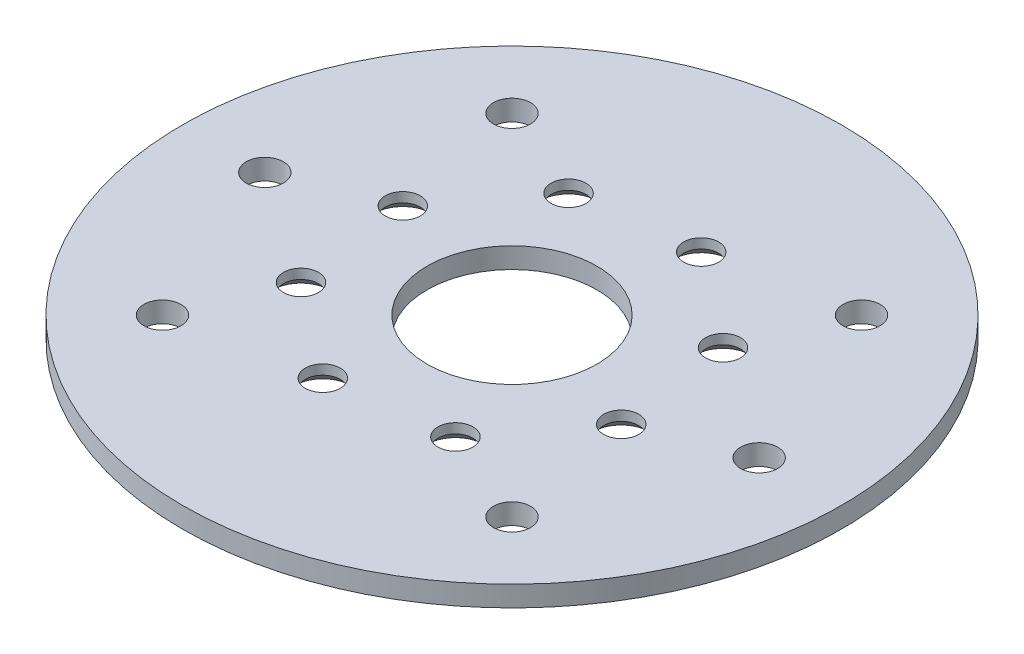
ISO-10303-21;
HEADER;
FILE_DESCRIPTION(('STEP AP214'),'2;1');
FILE_NAME('part.step','',(''),(''),'','','');
FILE_SCHEMA(('AUTOMOTIVE_DESIGN { 1 0 10303 214 1 1 1 1 }'));
ENDSEC;
DATA;
#1=APPLICATION_CONTEXT('core data for automotive mechanical design processes');
#2=APPLICATION_PROTOCOL_DEFINITION('international standard','automotive_design',2000,#1);
#3=PRODUCT_CONTEXT('',#1,'mechanical');
#4=PRODUCT('Part','Part','',(#3));
#5=PRODUCT_RELATED_PRODUCT_CATEGORY('part','',(#4));
#6=PRODUCT_DEFINITION_FORMATION('','',#4);
#7=PRODUCT_DEFINITION_CONTEXT('part definition',#1,'design');
#8=PRODUCT_DEFINITION('design','',#6,#7);
#9=PRODUCT_DEFINITION_SHAPE('','',#8);
#10=(LENGTH_UNIT() NAMED_UNIT(*) SI_UNIT(.MILLI.,.METRE.));
#11=(NAMED_UNIT(*) PLANE_ANGLE_UNIT() SI_UNIT($,.RADIAN.));
#12=(NAMED_UNIT(*) SI_UNIT($,.STERADIAN.) SOLID_ANGLE_UNIT());
#13=UNCERTAINTY_MEASURE_WITH_UNIT(LENGTH_MEASURE(1.E-05),#10,'distance_accuracy_value','');
#14=(GEOMETRIC_REPRESENTATION_CONTEXT(3) GLOBAL_UNCERTAINTY_ASSIGNED_CONTEXT((#13)) GLOBAL_UNIT_ASSIGNED_CONTEXT((#10,
#11,#12)) REPRESENTATION_CONTEXT('',''));
#15=CARTESIAN_POINT('',(0.,0.,0.));
#16=DIRECTION('',(0.,0.,1.));
#17=DIRECTION('',(1.,0.,0.));
#18=AXIS2_PLACEMENT_3D('',#15,#16,#17);
#19=CARTESIAN_POINT('',(0.,0.,0.));
#20=DIRECTION('',(0.,1.,0.));
#21=DIRECTION('',(0.,0.,1.));
#22=AXIS2_PLACEMENT_3D('',#19,#20,#21);
#23=PLANE('',#22);
#24=CARTESIAN_POINT('',(-16.9705627484772,0.,-16.9705627484771));
#25=DIRECTION('',(0.,-1.,0.));
#26=DIRECTION('',(0.,0.,-1.));
#27=AXIS2_PLACEMENT_3D('',#24,#25,#26);
#28=CIRCLE('',#27,1.8);
#29=CARTESIAN_POINT('',(-16.9705627484772,0.,-18.7705627484771));
#30=VERTEX_POINT('',#29);
#31=EDGE_CURVE('E142',#30,#30,#28,.T.);
#32=ORIENTED_EDGE('',*,*,#31,.F.);
#33=EDGE_LOOP('',(#32));
#34=FACE_BOUND('',#33,.T.);
#35=CARTESIAN_POINT('',(-24.,0.,1.64798730217797E-13));
#36=DIRECTION('',(0.,-1.,0.));
#37=DIRECTION('',(0.,0.,-1.));
#38=AXIS2_PLACEMENT_3D('',#35,#36,#37);
#39=CIRCLE('',#38,1.8);
#40=CARTESIAN_POINT('',(-24.,0.,-1.79999999999983));
#41=VERTEX_POINT('',#40);
#42=EDGE_CURVE('E136',#41,#41,#39,.T.);
#43=ORIENTED_EDGE('',*,*,#42,.F.);
#44=EDGE_LOOP('',(#43));
#45=FACE_BOUND('',#44,.T.);
#46=CARTESIAN_POINT('',(16.9705627484774,0.,16.9705627484769));
#47=DIRECTION('',(0.,-1.,0.));
#48=DIRECTION('',(0.,0.,-1.));
#49=AXIS2_PLACEMENT_3D('',#46,#47,#48);
#50=CIRCLE('',#49,1.8);
#51=CARTESIAN_POINT('',(16.9705627484774,0.,15.1705627484769));
#52=VERTEX_POINT('',#51);
#53=EDGE_CURVE('E124',#52,#52,#50,.T.);
#54=ORIENTED_EDGE('',*,*,#53,.F.);
#55=EDGE_LOOP('',(#54));
#56=FACE_BOUND('',#55,.T.);
#57=CARTESIAN_POINT('',(-12.9903810567648,0.,7.5000000000011));
#58=DIRECTION('',(0.,-1.,0.));
#59=DIRECTION('',(0.,0.,-1.));
#60=AXIS2_PLACEMENT_3D('',#57,#58,#59);
#61=CIRCLE('',#60,2.75);
#62=CARTESIAN_POINT('',(-12.9903810567648,0.,4.7500000000011));
#63=VERTEX_POINT('',#62);
#64=EDGE_CURVE('E82',#63,#63,#61,.T.);
#65=ORIENTED_EDGE('',*,*,#64,.F.);
#66=EDGE_LOOP('',(#65));
#67=FACE_BOUND('',#66,.T.);
#68=CARTESIAN_POINT('',(-14.4888873943349,0.,-3.88228567653623));
#69=DIRECTION('',(0.,-1.,0.));
#70=DIRECTION('',(0.,0.,-1.));
#71=AXIS2_PLACEMENT_3D('',#68,#69,#70);
#72=CIRCLE('',#71,2.75);
#73=CARTESIAN_POINT('',(-14.4888873943349,0.,-6.63228567653623));
#74=VERTEX_POINT('',#73);
#75=EDGE_CURVE('E73',#74,#74,#72,.T.);
#76=ORIENTED_EDGE('',*,*,#75,.F.);
#77=EDGE_LOOP('',(#76));
#78=FACE_BOUND('',#77,.T.);
#79=CARTESIAN_POINT('',(-7.49999999999965,0.,-12.9903810567651));
#80=DIRECTION('',(0.,-1.,0.));
#81=DIRECTION('',(0.,0.,-1.));
#82=AXIS2_PLACEMENT_3D('',#79,#80,#81);
#83=CIRCLE('',#82,2.75);
#84=CARTESIAN_POINT('',(-7.49999999999965,0.,-15.7403810567651));
#85=VERTEX_POINT('',#84);
#86=EDGE_CURVE('E64',#85,#85,#83,.T.);
#87=ORIENTED_EDGE('',*,*,#86,.F.);
#88=EDGE_LOOP('',(#87));
#89=FACE_BOUND('',#88,.T.);
#90=CARTESIAN_POINT('',(0.,0.,0.));
#91=DIRECTION('',(0.,1.,0.));
#92=DIRECTION('',(0.,0.,1.));
#93=AXIS2_PLACEMENT_3D('',#90,#91,#92);
#94=CIRCLE('',#93,32.);
#95=CARTESIAN_POINT('',(0.,0.,32.));
#96=VERTEX_POINT('',#95);
#97=EDGE_CURVE('E35',#96,#96,#94,.T.);
#98=ORIENTED_EDGE('',*,*,#97,.F.);
#99=EDGE_LOOP('',(#98));
#100=FACE_BOUND('',#99,.T.);
#101=CARTESIAN_POINT('',(0.,0.,0.));
#102=DIRECTION('',(0.,1.,0.));
#103=DIRECTION('',(0.,0.,1.));
#104=AXIS2_PLACEMENT_3D('',#101,#102,#103);
#105=CIRCLE('',#104,8.25);
#106=CARTESIAN_POINT('',(0.,0.,8.25));
#107=VERTEX_POINT('',#106);
#108=EDGE_CURVE('E44',#107,#107,#105,.T.);
#109=ORIENTED_EDGE('',*,*,#108,.T.);
#110=EDGE_LOOP('',(#109));
#111=FACE_BOUND('',#110,.T.);
#112=CARTESIAN_POINT('',(3.88228567653768,0.,-14.4888873943352));
#113=DIRECTION('',(0.,-1.,0.));
#114=DIRECTION('',(0.,0.,-1.));
#115=AXIS2_PLACEMENT_3D('',#112,#113,#114);
#116=CIRCLE('',#115,2.75);
#117=CARTESIAN_POINT('',(3.88228567653768,0.,-17.2388873943352));
#118=VERTEX_POINT('',#117);
#119=EDGE_CURVE('E55',#118,#118,#116,.T.);
#120=ORIENTED_EDGE('',*,*,#119,.F.);
#121=EDGE_LOOP('',(#120));
#122=FACE_BOUND('',#121,.T.);
#123=CARTESIAN_POINT('',(-3.88228567653586,0.,14.4888873943363));
#124=DIRECTION('',(0.,-1.,0.));
#125=DIRECTION('',(0.,0.,-1.));
#126=AXIS2_PLACEMENT_3D('',#123,#124,#125);
#127=CIRCLE('',#126,2.75);
#128=CARTESIAN_POINT('',(-3.88228567653586,0.,11.7388873943363));
#129=VERTEX_POINT('',#128);
#130=EDGE_CURVE('E91',#129,#129,#127,.T.);
#131=ORIENTED_EDGE('',*,*,#130,.F.);
#132=EDGE_LOOP('',(#131));
#133=FACE_BOUND('',#132,.T.);
#134=CARTESIAN_POINT('',(7.50000000000146,0.,12.9903810567662));
#135=DIRECTION('',(0.,-1.,0.));
#136=DIRECTION('',(0.,0.,-1.));
#137=AXIS2_PLACEMENT_3D('',#134,#135,#136);
#138=CIRCLE('',#137,2.75);
#139=CARTESIAN_POINT('',(7.50000000000146,0.,10.2403810567662));
#140=VERTEX_POINT('',#139);
#141=EDGE_CURVE('E100',#140,#140,#138,.T.);
#142=ORIENTED_EDGE('',*,*,#141,.F.);
#143=EDGE_LOOP('',(#142));
#144=FACE_BOUND('',#143,.T.);
#145=CARTESIAN_POINT('',(14.4888873943367,0.,3.88228567653731));
#146=DIRECTION('',(0.,-1.,0.));
#147=DIRECTION('',(0.,0.,-1.));
#148=AXIS2_PLACEMENT_3D('',#145,#146,#147);
#149=CIRCLE('',#148,2.75);
#150=CARTESIAN_POINT('',(14.4888873943367,0.,1.13228567653731));
#151=VERTEX_POINT('',#150);
#152=EDGE_CURVE('E109',#151,#151,#149,.T.);
#153=ORIENTED_EDGE('',*,*,#152,.F.);
#154=EDGE_LOOP('',(#153));
#155=FACE_BOUND('',#154,.T.);
#156=CARTESIAN_POINT('',(12.9903810567666,0.,-7.50000000000002));
#157=DIRECTION('',(0.,-1.,0.));
#158=DIRECTION('',(0.,0.,-1.));
#159=AXIS2_PLACEMENT_3D('',#156,#157,#158);
#160=CIRCLE('',#159,2.75);
#161=CARTESIAN_POINT('',(12.9903810567666,0.,-10.25));
#162=VERTEX_POINT('',#161);
#163=EDGE_CURVE('E118',#162,#162,#160,.T.);
#164=ORIENTED_EDGE('',*,*,#163,.F.);
#165=EDGE_LOOP('',(#164));
#166=FACE_BOUND('',#165,.T.);
#167=CARTESIAN_POINT('',(-16.970562748477,0.,16.9705627484773));
#168=DIRECTION('',(0.,-1.,0.));
#169=DIRECTION('',(0.,0.,-1.));
#170=AXIS2_PLACEMENT_3D('',#167,#168,#169);
#171=CIRCLE('',#170,1.8);
#172=CARTESIAN_POINT('',(-16.970562748477,0.,15.1705627484773));
#173=VERTEX_POINT('',#172);
#174=EDGE_CURVE('E130',#173,#173,#171,.T.);
#175=ORIENTED_EDGE('',*,*,#174,.F.);
#176=EDGE_LOOP('',(#175));
#177=FACE_BOUND('',#176,.T.);
#178=CARTESIAN_POINT('',(16.9705627484769,0.,-16.9705627484774));
#179=DIRECTION('',(0.,-1.,0.));
#180=DIRECTION('',(0.,0.,-1.));
#181=AXIS2_PLACEMENT_3D('',#178,#179,#180);
#182=CIRCLE('',#181,1.8);
#183=CARTESIAN_POINT('',(16.9705627484769,0.,-18.7705627484774));
#184=VERTEX_POINT('',#183);
#185=EDGE_CURVE('E148',#184,#184,#182,.T.);
#186=ORIENTED_EDGE('',*,*,#185,.F.);
#187=EDGE_LOOP('',(#186));
#188=FACE_BOUND('',#187,.T.);
#189=CARTESIAN_POINT('',(24.,0.,0.));
#190=DIRECTION('',(0.,-1.,0.));
#191=DIRECTION('',(0.,0.,-1.));
#192=AXIS2_PLACEMENT_3D('',#189,#190,#191);
#193=CIRCLE('',#192,1.8);
#194=CARTESIAN_POINT('',(24.,0.,-1.8));
#195=VERTEX_POINT('',#194);
#196=EDGE_CURVE('E154',#195,#195,#193,.T.);
#197=ORIENTED_EDGE('',*,*,#196,.F.);
#198=EDGE_LOOP('',(#197));
#199=FACE_BOUND('',#198,.T.);
#200=ADVANCED_FACE('F31',(#34,#45,#56,#67,#78,#89,#100,#111,#122,#133,#144,#155,#166,#177,#188,
#199),#23,.F.);
#201=CARTESIAN_POINT('',(0.,2.,0.));
#202=DIRECTION('',(0.,1.,0.));
#203=DIRECTION('',(0.,0.,1.));
#204=AXIS2_PLACEMENT_3D('',#201,#202,#203);
#205=PLANE('',#204);
#206=CARTESIAN_POINT('',(24.,2.,0.));
#207=DIRECTION('',(0.,1.,0.));
#208=DIRECTION('',(0.,0.,1.));
#209=AXIS2_PLACEMENT_3D('',#206,#207,#208);
#210=CIRCLE('',#209,1.8);
#211=CARTESIAN_POINT('',(24.,2.,1.8));
#212=VERTEX_POINT('',#211);
#213=EDGE_CURVE('E151',#212,#212,#210,.T.);
#214=ORIENTED_EDGE('',*,*,#213,.F.);
#215=EDGE_LOOP('',(#214));
#216=FACE_BOUND('',#215,.T.);
#217=CARTESIAN_POINT('',(16.9705627484769,2.,-16.9705627484774));
#218=DIRECTION('',(0.,1.,0.));
#219=DIRECTION('',(0.,0.,1.));
#220=AXIS2_PLACEMENT_3D('',#217,#218,#219);
#221=CIRCLE('',#220,1.8);
#222=CARTESIAN_POINT('',(16.9705627484769,2.,-15.1705627484774));
#223=VERTEX_POINT('',#222);
#224=EDGE_CURVE('E145',#223,#223,#221,.T.);
#225=ORIENTED_EDGE('',*,*,#224,.F.);
#226=EDGE_LOOP('',(#225));
#227=FACE_BOUND('',#226,.T.);
#228=CARTESIAN_POINT('',(-16.9705627484772,2.,-16.9705627484771));
#229=DIRECTION('',(0.,1.,0.));
#230=DIRECTION('',(0.,0.,1.));
#231=AXIS2_PLACEMENT_3D('',#228,#229,#230);
#232=CIRCLE('',#231,1.8);
#233=CARTESIAN_POINT('',(-16.9705627484772,2.,-15.1705627484771));
#234=VERTEX_POINT('',#233);
#235=EDGE_CURVE('E139',#234,#234,#232,.T.);
#236=ORIENTED_EDGE('',*,*,#235,.F.);
#237=EDGE_LOOP('',(#236));
#238=FACE_BOUND('',#237,.T.);
#239=CARTESIAN_POINT('',(-24.,2.,1.64798730217797E-13));
#240=DIRECTION('',(0.,1.,0.));
#241=DIRECTION('',(0.,0.,1.));
#242=AXIS2_PLACEMENT_3D('',#239,#240,#241);
#243=CIRCLE('',#242,1.8);
#244=CARTESIAN_POINT('',(-24.,2.,1.80000000000016));
#245=VERTEX_POINT('',#244);
#246=EDGE_CURVE('E133',#245,#245,#243,.T.);
#247=ORIENTED_EDGE('',*,*,#246,.F.);
#248=EDGE_LOOP('',(#247));
#249=FACE_BOUND('',#248,.T.);
#250=CARTESIAN_POINT('',(-16.970562748477,2.,16.9705627484773));
#251=DIRECTION('',(0.,1.,0.));
#252=DIRECTION('',(0.,0.,1.));
#253=AXIS2_PLACEMENT_3D('',#250,#251,#252);
#254=CIRCLE('',#253,1.8);
#255=CARTESIAN_POINT('',(-16.970562748477,2.,18.7705627484773));
#256=VERTEX_POINT('',#255);
#257=EDGE_CURVE('E127',#256,#256,#254,.T.);
#258=ORIENTED_EDGE('',*,*,#257,.F.);
#259=EDGE_LOOP('',(#258));
#260=FACE_BOUND('',#259,.T.);
#261=CARTESIAN_POINT('',(16.9705627484774,2.,16.9705627484769));
#262=DIRECTION('',(0.,1.,0.));
#263=DIRECTION('',(0.,0.,1.));
#264=AXIS2_PLACEMENT_3D('',#261,#262,#263);
#265=CIRCLE('',#264,1.8);
#266=CARTESIAN_POINT('',(16.9705627484774,2.,18.7705627484769));
#267=VERTEX_POINT('',#266);
#268=EDGE_CURVE('E121',#267,#267,#265,.T.);
#269=ORIENTED_EDGE('',*,*,#268,.F.);
#270=EDGE_LOOP('',(#269));
#271=FACE_BOUND('',#270,.T.);
#272=CARTESIAN_POINT('',(12.9903810567666,2.,-7.50000000000002));
#273=DIRECTION('',(0.,1.,0.));
#274=DIRECTION('',(0.,0.,1.));
#275=AXIS2_PLACEMENT_3D('',#272,#273,#274);
#276=CIRCLE('',#275,1.7);
#277=CARTESIAN_POINT('',(12.9903810567666,2.,-5.80000000000002));
#278=VERTEX_POINT('',#277);
#279=EDGE_CURVE('E112',#278,#278,#276,.T.);
#280=ORIENTED_EDGE('',*,*,#279,.F.);
#281=EDGE_LOOP('',(#280));
#282=FACE_BOUND('',#281,.T.);
#283=CARTESIAN_POINT('',(14.4888873943367,2.,3.88228567653731));
#284=DIRECTION('',(0.,1.,0.));
#285=DIRECTION('',(0.,0.,1.));
#286=AXIS2_PLACEMENT_3D('',#283,#284,#285);
#287=CIRCLE('',#286,1.7);
#288=CARTESIAN_POINT('',(14.4888873943367,2.,5.58228567653731));
#289=VERTEX_POINT('',#288);
#290=EDGE_CURVE('E103',#289,#289,#287,.T.);
#291=ORIENTED_EDGE('',*,*,#290,.F.);
#292=EDGE_LOOP('',(#291));
#293=FACE_BOUND('',#292,.T.);
#294=CARTESIAN_POINT('',(7.50000000000146,2.,12.9903810567662));
#295=DIRECTION('',(0.,1.,0.));
#296=DIRECTION('',(0.,0.,1.));
#297=AXIS2_PLACEMENT_3D('',#294,#295,#296);
#298=CIRCLE('',#297,1.7);
#299=CARTESIAN_POINT('',(7.50000000000146,2.,14.6903810567662));
#300=VERTEX_POINT('',#299);
#301=EDGE_CURVE('E94',#300,#300,#298,.T.);
#302=ORIENTED_EDGE('',*,*,#301,.F.);
#303=EDGE_LOOP('',(#302));
#304=FACE_BOUND('',#303,.T.);
#305=CARTESIAN_POINT('',(-3.88228567653586,2.,14.4888873943363));
#306=DIRECTION('',(0.,1.,0.));
#307=DIRECTION('',(0.,0.,1.));
#308=AXIS2_PLACEMENT_3D('',#305,#306,#307);
#309=CIRCLE('',#308,1.7);
#310=CARTESIAN_POINT('',(-3.88228567653586,2.,16.1888873943363));
#311=VERTEX_POINT('',#310);
#312=EDGE_CURVE('E85',#311,#311,#309,.T.);
#313=ORIENTED_EDGE('',*,*,#312,.F.);
#314=EDGE_LOOP('',(#313));
#315=FACE_BOUND('',#314,.T.);
#316=CARTESIAN_POINT('',(-12.9903810567648,2.,7.5000000000011));
#317=DIRECTION('',(0.,1.,0.));
#318=DIRECTION('',(0.,0.,1.));
#319=AXIS2_PLACEMENT_3D('',#316,#317,#318);
#320=CIRCLE('',#319,1.7);
#321=CARTESIAN_POINT('',(-12.9903810567648,2.,9.2000000000011));
#322=VERTEX_POINT('',#321);
#323=EDGE_CURVE('E76',#322,#322,#320,.T.);
#324=ORIENTED_EDGE('',*,*,#323,.F.);
#325=EDGE_LOOP('',(#324));
#326=FACE_BOUND('',#325,.T.);
#327=CARTESIAN_POINT('',(-14.4888873943349,2.,-3.88228567653623));
#328=DIRECTION('',(0.,1.,0.));
#329=DIRECTION('',(0.,0.,1.));
#330=AXIS2_PLACEMENT_3D('',#327,#328,#329);
#331=CIRCLE('',#330,1.7);
#332=CARTESIAN_POINT('',(-14.4888873943349,2.,-2.18228567653623));
#333=VERTEX_POINT('',#332);
#334=EDGE_CURVE('E67',#333,#333,#331,.T.);
#335=ORIENTED_EDGE('',*,*,#334,.F.);
#336=EDGE_LOOP('',(#335));
#337=FACE_BOUND('',#336,.T.);
#338=CARTESIAN_POINT('',(-7.49999999999965,2.,-12.9903810567651));
#339=DIRECTION('',(0.,1.,0.));
#340=DIRECTION('',(0.,0.,1.));
#341=AXIS2_PLACEMENT_3D('',#338,#339,#340);
#342=CIRCLE('',#341,1.7);
#343=CARTESIAN_POINT('',(-7.49999999999965,2.,-11.2903810567651));
#344=VERTEX_POINT('',#343);
#345=EDGE_CURVE('E58',#344,#344,#342,.T.);
#346=ORIENTED_EDGE('',*,*,#345,.F.);
#347=EDGE_LOOP('',(#346));
#348=FACE_BOUND('',#347,.T.);
#349=CARTESIAN_POINT('',(3.88228567653768,2.,-14.4888873943352));
#350=DIRECTION('',(0.,1.,0.));
#351=DIRECTION('',(0.,0.,1.));
#352=AXIS2_PLACEMENT_3D('',#349,#350,#351);
#353=CIRCLE('',#352,1.7);
#354=CARTESIAN_POINT('',(3.88228567653768,2.,-12.7888873943352));
#355=VERTEX_POINT('',#354);
#356=EDGE_CURVE('E47',#355,#355,#353,.T.);
#357=ORIENTED_EDGE('',*,*,#356,.F.);
#358=EDGE_LOOP('',(#357));
#359=FACE_BOUND('',#358,.T.);
#360=CARTESIAN_POINT('',(0.,2.,0.));
#361=DIRECTION('',(0.,1.,0.));
#362=DIRECTION('',(0.,0.,1.));
#363=AXIS2_PLACEMENT_3D('',#360,#361,#362);
#364=CIRCLE('',#363,32.);
#365=CARTESIAN_POINT('',(0.,2.,32.));
#366=VERTEX_POINT('',#365);
#367=EDGE_CURVE('E10',#366,#366,#364,.T.);
#368=ORIENTED_EDGE('',*,*,#367,.T.);
#369=EDGE_LOOP('',(#368));
#370=FACE_BOUND('',#369,.T.);
#371=CARTESIAN_POINT('',(0.,2.,0.));
#372=DIRECTION('',(0.,1.,0.));
#373=DIRECTION('',(0.,0.,1.));
#374=AXIS2_PLACEMENT_3D('',#371,#372,#373);
#375=CIRCLE('',#374,8.25);
#376=CARTESIAN_POINT('',(0.,2.,8.25));
#377=VERTEX_POINT('',#376);
#378=EDGE_CURVE('E42',#377,#377,#375,.T.);
#379=ORIENTED_EDGE('',*,*,#378,.F.);
#380=EDGE_LOOP('',(#379));
#381=FACE_BOUND('',#380,.T.);
#382=ADVANCED_FACE('F162',(#216,#227,#238,#249,#260,#271,#282,#293,#304,#315,#326,#337,#348,
#359,#370,#381),#205,.T.);
#383=CARTESIAN_POINT('',(0.,2.,0.));
#384=DIRECTION('',(0.,-1.,0.));
#385=DIRECTION('',(0.,0.,-1.));
#386=AXIS2_PLACEMENT_3D('',#383,#384,#385);
#387=CYLINDRICAL_SURFACE('',#386,32.);
#388=ORIENTED_EDGE('',*,*,#367,.F.);
#389=EDGE_LOOP('',(#388));
#390=FACE_BOUND('',#389,.T.);
#391=ORIENTED_EDGE('',*,*,#97,.T.);
#392=EDGE_LOOP('',(#391));
#393=FACE_BOUND('',#392,.T.);
#394=ADVANCED_FACE('F33',(#390,#393),#387,.T.);
#395=CARTESIAN_POINT('',(0.,2.,0.));
#396=DIRECTION('',(0.,-1.,0.));
#397=DIRECTION('',(0.,0.,-1.));
#398=AXIS2_PLACEMENT_3D('',#395,#396,#397);
#399=CYLINDRICAL_SURFACE('',#398,8.25);
#400=ORIENTED_EDGE('',*,*,#378,.T.);
#401=EDGE_LOOP('',(#400));
#402=FACE_BOUND('',#401,.T.);
#403=ORIENTED_EDGE('',*,*,#108,.F.);
#404=EDGE_LOOP('',(#403));
#405=FACE_BOUND('',#404,.T.);
#406=ADVANCED_FACE('F172',(#402,#405),#399,.F.);
#407=CARTESIAN_POINT('',(3.88228567653768,0.,-14.4888873943352));
#408=DIRECTION('',(0.,-1.,0.));
#409=DIRECTION('',(0.,0.,-1.));
#410=AXIS2_PLACEMENT_3D('',#407,#408,#409);
#411=CYLINDRICAL_SURFACE('',#410,1.7);
#412=CARTESIAN_POINT('',(3.88228567653768,1.05,-14.4888873943352));
#413=DIRECTION('',(0.,-1.,0.));
#414=DIRECTION('',(0.,0.,-1.));
#415=AXIS2_PLACEMENT_3D('',#412,#413,#414);
#416=CIRCLE('',#415,1.7);
#417=CARTESIAN_POINT('',(3.88228567653768,1.05,-16.1888873943352));
#418=VERTEX_POINT('',#417);
#419=EDGE_CURVE('E52',#418,#418,#416,.T.);
#420=ORIENTED_EDGE('',*,*,#419,.T.);
#421=EDGE_LOOP('',(#420));
#422=FACE_BOUND('',#421,.T.);
#423=ORIENTED_EDGE('',*,*,#356,.T.);
#424=EDGE_LOOP('',(#423));
#425=FACE_BOUND('',#424,.T.);
#426=ADVANCED_FACE('F175',(#422,#425),#411,.F.);
#427=CARTESIAN_POINT('',(3.88228567653768,0.,-14.4888873943352));
#428=DIRECTION('',(0.,-1.,0.));
#429=DIRECTION('',(0.,0.,-1.));
#430=AXIS2_PLACEMENT_3D('',#427,#428,#429);
#431=CONICAL_SURFACE('',#430,2.75,0.785398163397448);
#432=ORIENTED_EDGE('',*,*,#419,.F.);
#433=EDGE_LOOP('',(#432));
#434=FACE_BOUND('',#433,.T.);
#435=ORIENTED_EDGE('',*,*,#119,.T.);
#436=EDGE_LOOP('',(#435));
#437=FACE_BOUND('',#436,.T.);
#438=ADVANCED_FACE('F179',(#434,#437),#431,.F.);
#439=CARTESIAN_POINT('',(-7.49999999999965,0.,-12.9903810567651));
#440=DIRECTION('',(0.,-1.,0.));
#441=DIRECTION('',(0.,0.,-1.));
#442=AXIS2_PLACEMENT_3D('',#439,#440,#441);
#443=CYLINDRICAL_SURFACE('',#442,1.7);
#444=CARTESIAN_POINT('',(-7.49999999999965,1.05,-12.9903810567651));
#445=DIRECTION('',(0.,-1.,0.));
#446=DIRECTION('',(0.,0.,-1.));
#447=AXIS2_PLACEMENT_3D('',#444,#445,#446);
#448=CIRCLE('',#447,1.7);
#449=CARTESIAN_POINT('',(-7.49999999999965,1.05,-14.6903810567651));
#450=VERTEX_POINT('',#449);
#451=EDGE_CURVE('E61',#450,#450,#448,.T.);
#452=ORIENTED_EDGE('',*,*,#451,.T.);
#453=EDGE_LOOP('',(#452));
#454=FACE_BOUND('',#453,.T.);
#455=ORIENTED_EDGE('',*,*,#345,.T.);
#456=EDGE_LOOP('',(#455));
#457=FACE_BOUND('',#456,.T.);
#458=ADVANCED_FACE('F183',(#454,#457),#443,.F.);
#459=CARTESIAN_POINT('',(-7.49999999999965,0.,-12.9903810567651));
#460=DIRECTION('',(0.,-1.,0.));
#461=DIRECTION('',(0.,0.,-1.));
#462=AXIS2_PLACEMENT_3D('',#459,#460,#461);
#463=CONICAL_SURFACE('',#462,2.75,0.785398163397448);
#464=ORIENTED_EDGE('',*,*,#451,.F.);
#465=EDGE_LOOP('',(#464));
#466=FACE_BOUND('',#465,.T.);
#467=ORIENTED_EDGE('',*,*,#86,.T.);
#468=EDGE_LOOP('',(#467));
#469=FACE_BOUND('',#468,.T.);
#470=ADVANCED_FACE('F187',(#466,#469),#463,.F.);
#471=CARTESIAN_POINT('',(-14.4888873943349,0.,-3.88228567653623));
#472=DIRECTION('',(0.,-1.,0.));
#473=DIRECTION('',(0.,0.,-1.));
#474=AXIS2_PLACEMENT_3D('',#471,#472,#473);
#475=CYLINDRICAL_SURFACE('',#474,1.7);
#476=CARTESIAN_POINT('',(-14.4888873943349,1.05,-3.88228567653623));
#477=DIRECTION('',(0.,-1.,0.));
#478=DIRECTION('',(0.,0.,-1.));
#479=AXIS2_PLACEMENT_3D('',#476,#477,#478);
#480=CIRCLE('',#479,1.7);
#481=CARTESIAN_POINT('',(-14.4888873943349,1.05,-5.58228567653623));
#482=VERTEX_POINT('',#481);
#483=EDGE_CURVE('E70',#482,#482,#480,.T.);
#484=ORIENTED_EDGE('',*,*,#483,.T.);
#485=EDGE_LOOP('',(#484));
#486=FACE_BOUND('',#485,.T.);
#487=ORIENTED_EDGE('',*,*,#334,.T.);
#488=EDGE_LOOP('',(#487));
#489=FACE_BOUND('',#488,.T.);
#490=ADVANCED_FACE('F191',(#486,#489),#475,.F.);
#491=CARTESIAN_POINT('',(-14.4888873943349,0.,-3.88228567653623));
#492=DIRECTION('',(0.,-1.,0.));
#493=DIRECTION('',(0.,0.,-1.));
#494=AXIS2_PLACEMENT_3D('',#491,#492,#493);
#495=CONICAL_SURFACE('',#494,2.75,0.785398163397448);
#496=ORIENTED_EDGE('',*,*,#483,.F.);
#497=EDGE_LOOP('',(#496));
#498=FACE_BOUND('',#497,.T.);
#499=ORIENTED_EDGE('',*,*,#75,.T.);
#500=EDGE_LOOP('',(#499));
#501=FACE_BOUND('',#500,.T.);
#502=ADVANCED_FACE('F195',(#498,#501),#495,.F.);
#503=CARTESIAN_POINT('',(-12.9903810567648,0.,7.5000000000011));
#504=DIRECTION('',(0.,-1.,0.));
#505=DIRECTION('',(0.,0.,-1.));
#506=AXIS2_PLACEMENT_3D('',#503,#504,#505);
#507=CYLINDRICAL_SURFACE('',#506,1.7);
#508=CARTESIAN_POINT('',(-12.9903810567648,1.05,7.5000000000011));
#509=DIRECTION('',(0.,-1.,0.));
#510=DIRECTION('',(0.,0.,-1.));
#511=AXIS2_PLACEMENT_3D('',#508,#509,#510);
#512=CIRCLE('',#511,1.7);
#513=CARTESIAN_POINT('',(-12.9903810567648,1.05,5.8000000000011));
#514=VERTEX_POINT('',#513);
#515=EDGE_CURVE('E79',#514,#514,#512,.T.);
#516=ORIENTED_EDGE('',*,*,#515,.T.);
#517=EDGE_LOOP('',(#516));
#518=FACE_BOUND('',#517,.T.);
#519=ORIENTED_EDGE('',*,*,#323,.T.);
#520=EDGE_LOOP('',(#519));
#521=FACE_BOUND('',#520,.T.);
#522=ADVANCED_FACE('F199',(#518,#521),#507,.F.);
#523=CARTESIAN_POINT('',(-12.9903810567648,0.,7.5000000000011));
#524=DIRECTION('',(0.,-1.,0.));
#525=DIRECTION('',(0.,0.,-1.));
#526=AXIS2_PLACEMENT_3D('',#523,#524,#525);
#527=CONICAL_SURFACE('',#526,2.75,0.785398163397448);
#528=ORIENTED_EDGE('',*,*,#515,.F.);
#529=EDGE_LOOP('',(#528));
#530=FACE_BOUND('',#529,.T.);
#531=ORIENTED_EDGE('',*,*,#64,.T.);
#532=EDGE_LOOP('',(#531));
#533=FACE_BOUND('',#532,.T.);
#534=ADVANCED_FACE('F203',(#530,#533),#527,.F.);
#535=CARTESIAN_POINT('',(-3.88228567653586,0.,14.4888873943363));
#536=DIRECTION('',(0.,-1.,0.));
#537=DIRECTION('',(0.,0.,-1.));
#538=AXIS2_PLACEMENT_3D('',#535,#536,#537);
#539=CYLINDRICAL_SURFACE('',#538,1.7);
#540=CARTESIAN_POINT('',(-3.88228567653586,1.05,14.4888873943363));
#541=DIRECTION('',(0.,-1.,0.));
#542=DIRECTION('',(0.,0.,-1.));
#543=AXIS2_PLACEMENT_3D('',#540,#541,#542);
#544=CIRCLE('',#543,1.7);
#545=CARTESIAN_POINT('',(-3.88228567653586,1.05,12.7888873943363));
#546=VERTEX_POINT('',#545);
#547=EDGE_CURVE('E88',#546,#546,#544,.T.);
#548=ORIENTED_EDGE('',*,*,#547,.T.);
#549=EDGE_LOOP('',(#548));
#550=FACE_BOUND('',#549,.T.);
#551=ORIENTED_EDGE('',*,*,#312,.T.);
#552=EDGE_LOOP('',(#551));
#553=FACE_BOUND('',#552,.T.);
#554=ADVANCED_FACE('F207',(#550,#553),#539,.F.);
#555=CARTESIAN_POINT('',(-3.88228567653586,0.,14.4888873943363));
#556=DIRECTION('',(0.,-1.,0.));
#557=DIRECTION('',(0.,0.,-1.));
#558=AXIS2_PLACEMENT_3D('',#555,#556,#557);
#559=CONICAL_SURFACE('',#558,2.75,0.785398163397448);
#560=ORIENTED_EDGE('',*,*,#547,.F.);
#561=EDGE_LOOP('',(#560));
#562=FACE_BOUND('',#561,.T.);
#563=ORIENTED_EDGE('',*,*,#130,.T.);
#564=EDGE_LOOP('',(#563));
#565=FACE_BOUND('',#564,.T.);
#566=ADVANCED_FACE('F211',(#562,#565),#559,.F.);
#567=CARTESIAN_POINT('',(7.50000000000146,0.,12.9903810567662));
#568=DIRECTION('',(0.,-1.,0.));
#569=DIRECTION('',(0.,0.,-1.));
#570=AXIS2_PLACEMENT_3D('',#567,#568,#569);
#571=CYLINDRICAL_SURFACE('',#570,1.7);
#572=CARTESIAN_POINT('',(7.50000000000146,1.05,12.9903810567662));
#573=DIRECTION('',(0.,-1.,0.));
#574=DIRECTION('',(0.,0.,-1.));
#575=AXIS2_PLACEMENT_3D('',#572,#573,#574);
#576=CIRCLE('',#575,1.7);
#577=CARTESIAN_POINT('',(7.50000000000146,1.05,11.2903810567662));
#578=VERTEX_POINT('',#577);
#579=EDGE_CURVE('E97',#578,#578,#576,.T.);
#580=ORIENTED_EDGE('',*,*,#579,.T.);
#581=EDGE_LOOP('',(#580));
#582=FACE_BOUND('',#581,.T.);
#583=ORIENTED_EDGE('',*,*,#301,.T.);
#584=EDGE_LOOP('',(#583));
#585=FACE_BOUND('',#584,.T.);
#586=ADVANCED_FACE('F215',(#582,#585),#571,.F.);
#587=CARTESIAN_POINT('',(7.50000000000146,0.,12.9903810567662));
#588=DIRECTION('',(0.,-1.,0.));
#589=DIRECTION('',(0.,0.,-1.));
#590=AXIS2_PLACEMENT_3D('',#587,#588,#589);
#591=CONICAL_SURFACE('',#590,2.75,0.785398163397448);
#592=ORIENTED_EDGE('',*,*,#579,.F.);
#593=EDGE_LOOP('',(#592));
#594=FACE_BOUND('',#593,.T.);
#595=ORIENTED_EDGE('',*,*,#141,.T.);
#596=EDGE_LOOP('',(#595));
#597=FACE_BOUND('',#596,.T.);
#598=ADVANCED_FACE('F219',(#594,#597),#591,.F.);
#599=CARTESIAN_POINT('',(14.4888873943367,0.,3.88228567653731));
#600=DIRECTION('',(0.,-1.,0.));
#601=DIRECTION('',(0.,0.,-1.));
#602=AXIS2_PLACEMENT_3D('',#599,#600,#601);
#603=CYLINDRICAL_SURFACE('',#602,1.7);
#604=CARTESIAN_POINT('',(14.4888873943367,1.05,3.88228567653731));
#605=DIRECTION('',(0.,-1.,0.));
#606=DIRECTION('',(0.,0.,-1.));
#607=AXIS2_PLACEMENT_3D('',#604,#605,#606);
#608=CIRCLE('',#607,1.7);
#609=CARTESIAN_POINT('',(14.4888873943367,1.05,2.18228567653731));
#610=VERTEX_POINT('',#609);
#611=EDGE_CURVE('E106',#610,#610,#608,.T.);
#612=ORIENTED_EDGE('',*,*,#611,.T.);
#613=EDGE_LOOP('',(#612));
#614=FACE_BOUND('',#613,.T.);
#615=ORIENTED_EDGE('',*,*,#290,.T.);
#616=EDGE_LOOP('',(#615));
#617=FACE_BOUND('',#616,.T.);
#618=ADVANCED_FACE('F223',(#614,#617),#603,.F.);
#619=CARTESIAN_POINT('',(14.4888873943367,0.,3.88228567653731));
#620=DIRECTION('',(0.,-1.,0.));
#621=DIRECTION('',(0.,0.,-1.));
#622=AXIS2_PLACEMENT_3D('',#619,#620,#621);
#623=CONICAL_SURFACE('',#622,2.75,0.785398163397447);
#624=ORIENTED_EDGE('',*,*,#611,.F.);
#625=EDGE_LOOP('',(#624));
#626=FACE_BOUND('',#625,.T.);
#627=ORIENTED_EDGE('',*,*,#152,.T.);
#628=EDGE_LOOP('',(#627));
#629=FACE_BOUND('',#628,.T.);
#630=ADVANCED_FACE('F227',(#626,#629),#623,.F.);
#631=CARTESIAN_POINT('',(12.9903810567666,0.,-7.50000000000002));
#632=DIRECTION('',(0.,-1.,0.));
#633=DIRECTION('',(0.,0.,-1.));
#634=AXIS2_PLACEMENT_3D('',#631,#632,#633);
#635=CYLINDRICAL_SURFACE('',#634,1.7);
#636=CARTESIAN_POINT('',(12.9903810567666,1.05,-7.50000000000002));
#637=DIRECTION('',(0.,-1.,0.));
#638=DIRECTION('',(0.,0.,-1.));
#639=AXIS2_PLACEMENT_3D('',#636,#637,#638);
#640=CIRCLE('',#639,1.7);
#641=CARTESIAN_POINT('',(12.9903810567666,1.05,-9.20000000000002));
#642=VERTEX_POINT('',#641);
#643=EDGE_CURVE('E115',#642,#642,#640,.T.);
#644=ORIENTED_EDGE('',*,*,#643,.T.);
#645=EDGE_LOOP('',(#644));
#646=FACE_BOUND('',#645,.T.);
#647=ORIENTED_EDGE('',*,*,#279,.T.);
#648=EDGE_LOOP('',(#647));
#649=FACE_BOUND('',#648,.T.);
#650=ADVANCED_FACE('F231',(#646,#649),#635,.F.);
#651=CARTESIAN_POINT('',(12.9903810567666,0.,-7.50000000000002));
#652=DIRECTION('',(0.,-1.,0.));
#653=DIRECTION('',(0.,0.,-1.));
#654=AXIS2_PLACEMENT_3D('',#651,#652,#653);
#655=CONICAL_SURFACE('',#654,2.75,0.785398163397447);
#656=ORIENTED_EDGE('',*,*,#643,.F.);
#657=EDGE_LOOP('',(#656));
#658=FACE_BOUND('',#657,.T.);
#659=ORIENTED_EDGE('',*,*,#163,.T.);
#660=EDGE_LOOP('',(#659));
#661=FACE_BOUND('',#660,.T.);
#662=ADVANCED_FACE('F235',(#658,#661),#655,.F.);
#663=CARTESIAN_POINT('',(16.9705627484774,0.,16.9705627484769));
#664=DIRECTION('',(0.,-1.,0.));
#665=DIRECTION('',(0.,0.,-1.));
#666=AXIS2_PLACEMENT_3D('',#663,#664,#665);
#667=CYLINDRICAL_SURFACE('',#666,1.8);
#668=ORIENTED_EDGE('',*,*,#53,.T.);
#669=EDGE_LOOP('',(#668));
#670=FACE_BOUND('',#669,.T.);
#671=ORIENTED_EDGE('',*,*,#268,.T.);
#672=EDGE_LOOP('',(#671));
#673=FACE_BOUND('',#672,.T.);
#674=ADVANCED_FACE('F239',(#670,#673),#667,.F.);
#675=CARTESIAN_POINT('',(-16.970562748477,0.,16.9705627484773));
#676=DIRECTION('',(0.,-1.,0.));
#677=DIRECTION('',(0.,0.,-1.));
#678=AXIS2_PLACEMENT_3D('',#675,#676,#677);
#679=CYLINDRICAL_SURFACE('',#678,1.8);
#680=ORIENTED_EDGE('',*,*,#174,.T.);
#681=EDGE_LOOP('',(#680));
#682=FACE_BOUND('',#681,.T.);
#683=ORIENTED_EDGE('',*,*,#257,.T.);
#684=EDGE_LOOP('',(#683));
#685=FACE_BOUND('',#684,.T.);
#686=ADVANCED_FACE('F243',(#682,#685),#679,.F.);
#687=CARTESIAN_POINT('',(-24.,0.,1.64798730217797E-13));
#688=DIRECTION('',(0.,-1.,0.));
#689=DIRECTION('',(0.,0.,-1.));
#690=AXIS2_PLACEMENT_3D('',#687,#688,#689);
#691=CYLINDRICAL_SURFACE('',#690,1.8);
#692=ORIENTED_EDGE('',*,*,#42,.T.);
#693=EDGE_LOOP('',(#692));
#694=FACE_BOUND('',#693,.T.);
#695=ORIENTED_EDGE('',*,*,#246,.T.);
#696=EDGE_LOOP('',(#695));
#697=FACE_BOUND('',#696,.T.);
#698=ADVANCED_FACE('F247',(#694,#697),#691,.F.);
#699=CARTESIAN_POINT('',(-16.9705627484772,0.,-16.9705627484771));
#700=DIRECTION('',(0.,-1.,0.));
#701=DIRECTION('',(0.,0.,-1.));
#702=AXIS2_PLACEMENT_3D('',#699,#700,#701);
#703=CYLINDRICAL_SURFACE('',#702,1.8);
#704=ORIENTED_EDGE('',*,*,#31,.T.);
#705=EDGE_LOOP('',(#704));
#706=FACE_BOUND('',#705,.T.);
#707=ORIENTED_EDGE('',*,*,#235,.T.);
#708=EDGE_LOOP('',(#707));
#709=FACE_BOUND('',#708,.T.);
#710=ADVANCED_FACE('F251',(#706,#709),#703,.F.);
#711=CARTESIAN_POINT('',(16.9705627484769,0.,-16.9705627484774));
#712=DIRECTION('',(0.,-1.,0.));
#713=DIRECTION('',(0.,0.,-1.));
#714=AXIS2_PLACEMENT_3D('',#711,#712,#713);
#715=CYLINDRICAL_SURFACE('',#714,1.8);
#716=ORIENTED_EDGE('',*,*,#185,.T.);
#717=EDGE_LOOP('',(#716));
#718=FACE_BOUND('',#717,.T.);
#719=ORIENTED_EDGE('',*,*,#224,.T.);
#720=EDGE_LOOP('',(#719));
#721=FACE_BOUND('',#720,.T.);
#722=ADVANCED_FACE('F255',(#718,#721),#715,.F.);
#723=CARTESIAN_POINT('',(24.,0.,0.));
#724=DIRECTION('',(0.,-1.,0.));
#725=DIRECTION('',(0.,0.,-1.));
#726=AXIS2_PLACEMENT_3D('',#723,#724,#725);
#727=CYLINDRICAL_SURFACE('',#726,1.8);
#728=ORIENTED_EDGE('',*,*,#196,.T.);
#729=EDGE_LOOP('',(#728));
#730=FACE_BOUND('',#729,.T.);
#731=ORIENTED_EDGE('',*,*,#213,.T.);
#732=EDGE_LOOP('',(#731));
#733=FACE_BOUND('',#732,.T.);
#734=ADVANCED_FACE('F158',(#730,#733),#727,.F.);
#735=CLOSED_SHELL('',(#200,#382,#394,#406,#426,#438,#458,#470,#490,#502,#522,#534,#554,#566,
#586,#598,#618,#630,#650,#662,#674,#686,#698,#710,#722,#734));
#736=MANIFOLD_SOLID_BREP('B2',#735);
#737=ADVANCED_BREP_SHAPE_REPRESENTATION('',(#18,#736),#14);
#738=SHAPE_DEFINITION_REPRESENTATION(#9,#737);
ENDSEC;
END-ISO-10303-21;
